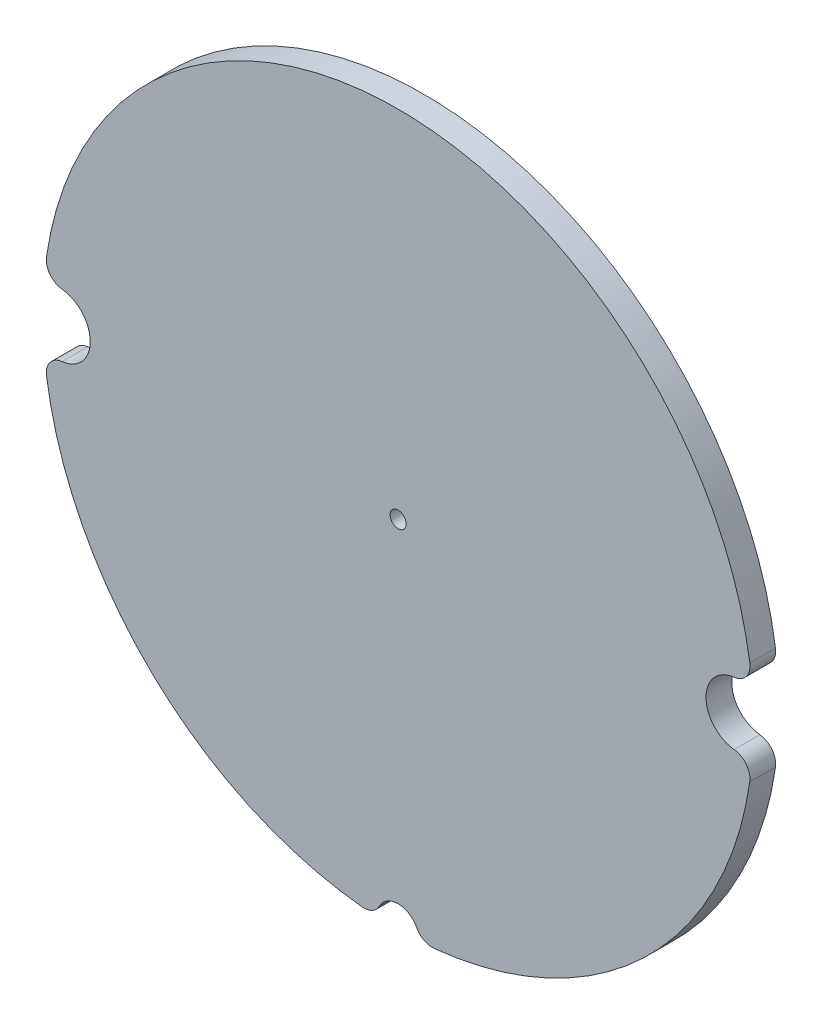
ISO-10303-21;
HEADER;
FILE_DESCRIPTION(('STEP AP214'),'2;1');
FILE_NAME('part.step','',(''),(''),'','','');
FILE_SCHEMA(('AUTOMOTIVE_DESIGN { 1 0 10303 214 1 1 1 1 }'));
ENDSEC;
DATA;
#1=APPLICATION_CONTEXT('core data for automotive mechanical design processes');
#2=APPLICATION_PROTOCOL_DEFINITION('international standard','automotive_design',2000,#1);
#3=PRODUCT_CONTEXT('',#1,'mechanical');
#4=PRODUCT('Part','Part','',(#3));
#5=PRODUCT_RELATED_PRODUCT_CATEGORY('part','',(#4));
#6=PRODUCT_DEFINITION_FORMATION('','',#4);
#7=PRODUCT_DEFINITION_CONTEXT('part definition',#1,'design');
#8=PRODUCT_DEFINITION('design','',#6,#7);
#9=PRODUCT_DEFINITION_SHAPE('','',#8);
#10=(LENGTH_UNIT() NAMED_UNIT(*) SI_UNIT(.MILLI.,.METRE.));
#11=(NAMED_UNIT(*) PLANE_ANGLE_UNIT() SI_UNIT($,.RADIAN.));
#12=(NAMED_UNIT(*) SI_UNIT($,.STERADIAN.) SOLID_ANGLE_UNIT());
#13=UNCERTAINTY_MEASURE_WITH_UNIT(LENGTH_MEASURE(1.E-05),#10,'distance_accuracy_value','');
#14=(GEOMETRIC_REPRESENTATION_CONTEXT(3) GLOBAL_UNCERTAINTY_ASSIGNED_CONTEXT((#13)) GLOBAL_UNIT_ASSIGNED_CONTEXT((#10,
#11,#12)) REPRESENTATION_CONTEXT('',''));
#15=CARTESIAN_POINT('',(0.,0.,0.));
#16=DIRECTION('',(0.,0.,1.));
#17=DIRECTION('',(1.,0.,0.));
#18=AXIS2_PLACEMENT_3D('',#15,#16,#17);
#19=CARTESIAN_POINT('',(-1.120000004768,-10.99300003051,0.80000348));
#20=DIRECTION('',(0.,0.,-1.));
#21=DIRECTION('',(-1.,0.,0.));
#22=AXIS2_PLACEMENT_3D('',#19,#20,#21);
#23=PLANE('',#22);
#24=CARTESIAN_POINT('',(0.,0.,0.80000348));
#25=DIRECTION('',(0.,0.,-1.));
#26=DIRECTION('',(-1.,0.,0.));
#27=AXIS2_PLACEMENT_3D('',#24,#25,#26);
#28=CIRCLE('',#27,0.2499995);
#29=CARTESIAN_POINT('',(-0.2499995,0.,0.80000348));
#30=VERTEX_POINT('',#29);
#31=EDGE_CURVE('E119',#30,#30,#28,.T.);
#32=ORIENTED_EDGE('',*,*,#31,.T.);
#33=EDGE_LOOP('',(#32));
#34=FACE_BOUND('',#33,.T.);
#35=CARTESIAN_POINT('',(0.,-10.99896654372,0.80000348));
#36=DIRECTION('',(0.,0.,-1.));
#37=DIRECTION('',(-1.,0.,0.));
#38=AXIS2_PLACEMENT_3D('',#35,#36,#37);
#39=CIRCLE('',#38,0.648966162251);
#40=CARTESIAN_POINT('',(-0.575999975203237,-10.6999998092604,0.80000348));
#41=VERTEX_POINT('',#40);
#42=CARTESIAN_POINT('',(0.575999975202705,-10.6999998092607,0.80000348));
#43=VERTEX_POINT('',#42);
#44=EDGE_CURVE('E128',#41,#43,#39,.T.);
#45=ORIENTED_EDGE('',*,*,#44,.T.);
#46=CARTESIAN_POINT('',(1.064088565313,-10.44529820453,0.80000348));
#47=DIRECTION('',(0.,0.,-1.));
#48=DIRECTION('',(-1.,0.,0.));
#49=AXIS2_PLACEMENT_3D('',#46,#47,#48);
#50=CIRCLE('',#49,0.550548253332);
#51=CARTESIAN_POINT('',(1.12000000476851,-10.993000030515,0.80000348));
#52=VERTEX_POINT('',#51);
#53=EDGE_CURVE('E130',#52,#43,#50,.T.);
#54=ORIENTED_EDGE('',*,*,#53,.F.);
#55=CARTESIAN_POINT('',(0.001166001366866,-0.0004141172533059,0.80000348));
#56=DIRECTION('',(0.,0.,-1.));
#57=DIRECTION('',(-1.,0.,0.));
#58=AXIS2_PLACEMENT_3D('',#55,#56,#57);
#59=CIRCLE('',#58,11.049377113107);
#60=CARTESIAN_POINT('',(10.9340000152586,-1.60099995136293,0.80000348));
#61=VERTEX_POINT('',#60);
#62=EDGE_CURVE('E134',#61,#52,#59,.T.);
#63=ORIENTED_EDGE('',*,*,#62,.F.);
#64=CARTESIAN_POINT('',(10.38866728457,-1.521844010123,0.80000348));
#65=DIRECTION('',(0.,0.,-1.));
#66=DIRECTION('',(-1.,0.,0.));
#67=AXIS2_PLACEMENT_3D('',#64,#65,#66);
#68=CIRCLE('',#67,0.551047593402);
#69=CARTESIAN_POINT('',(10.447999954224,-0.973999977112023,0.80000348));
#70=VERTEX_POINT('',#69);
#71=EDGE_CURVE('E137',#70,#61,#68,.T.);
#72=ORIENTED_EDGE('',*,*,#71,.F.);
#73=CARTESIAN_POINT('',(10.552600500174,0.,0.80000348));
#74=DIRECTION('',(0.,0.,-1.));
#75=DIRECTION('',(-1.,0.,0.));
#76=AXIS2_PLACEMENT_3D('',#73,#74,#75);
#77=CIRCLE('',#76,0.979600545951);
#78=CARTESIAN_POINT('',(10.447999954224,0.973999977112144,0.80000348));
#79=VERTEX_POINT('',#78);
#80=EDGE_CURVE('E140',#70,#79,#77,.T.);
#81=ORIENTED_EDGE('',*,*,#80,.T.);
#82=CARTESIAN_POINT('',(10.38866728457,1.521844010123,0.80000348));
#83=DIRECTION('',(0.,0.,-1.));
#84=DIRECTION('',(-1.,0.,0.));
#85=AXIS2_PLACEMENT_3D('',#82,#83,#84);
#86=CIRCLE('',#85,0.551047593402);
#87=CARTESIAN_POINT('',(10.9340000152587,1.60099995136296,0.80000348));
#88=VERTEX_POINT('',#87);
#89=EDGE_CURVE('E143',#88,#79,#86,.T.);
#90=ORIENTED_EDGE('',*,*,#89,.F.);
#91=CARTESIAN_POINT('',(0.,-0.0006907060202717,0.80000348));
#92=DIRECTION('',(0.,0.,-1.));
#93=DIRECTION('',(-1.,0.,0.));
#94=AXIS2_PLACEMENT_3D('',#91,#92,#93);
#95=CIRCLE('',#94,11.050690896755);
#96=CARTESIAN_POINT('',(-10.9340000152585,1.60099995136424,0.80000348));
#97=VERTEX_POINT('',#96);
#98=EDGE_CURVE('E147',#97,#88,#95,.T.);
#99=ORIENTED_EDGE('',*,*,#98,.F.);
#100=CARTESIAN_POINT('',(-10.38866728457,1.521844010123,0.80000348));
#101=DIRECTION('',(0.,0.,-1.));
#102=DIRECTION('',(-1.,0.,0.));
#103=AXIS2_PLACEMENT_3D('',#100,#101,#102);
#104=CIRCLE('',#103,0.551047593402);
#105=CARTESIAN_POINT('',(-10.44799995422,0.973999977111809,0.80000348));
#106=VERTEX_POINT('',#105);
#107=EDGE_CURVE('E150',#106,#97,#104,.T.);
#108=ORIENTED_EDGE('',*,*,#107,.F.);
#109=CARTESIAN_POINT('',(-10.55260050017,0.,0.80000348));
#110=DIRECTION('',(0.,0.,-1.));
#111=DIRECTION('',(-1.,0.,0.));
#112=AXIS2_PLACEMENT_3D('',#109,#110,#111);
#113=CIRCLE('',#112,0.979600545951);
#114=CARTESIAN_POINT('',(-10.44799995422,-0.973999977112144,0.80000348));
#115=VERTEX_POINT('',#114);
#116=EDGE_CURVE('E153',#106,#115,#113,.T.);
#117=ORIENTED_EDGE('',*,*,#116,.T.);
#118=CARTESIAN_POINT('',(-10.38866728457,-1.521844010123,0.80000348));
#119=DIRECTION('',(0.,0.,-1.));
#120=DIRECTION('',(-1.,0.,0.));
#121=AXIS2_PLACEMENT_3D('',#118,#119,#120);
#122=CIRCLE('',#121,0.551047593402);
#123=CARTESIAN_POINT('',(-10.9340000152584,-1.60099995136422,0.80000348));
#124=VERTEX_POINT('',#123);
#125=EDGE_CURVE('E108',#124,#115,#122,.T.);
#126=ORIENTED_EDGE('',*,*,#125,.F.);
#127=CARTESIAN_POINT('',(-0.001166001366866,-0.0004141172533059,0.80000348));
#128=DIRECTION('',(0.,0.,-1.));
#129=DIRECTION('',(-1.,0.,0.));
#130=AXIS2_PLACEMENT_3D('',#127,#128,#129);
#131=CIRCLE('',#130,11.049377113107);
#132=CARTESIAN_POINT('',(-1.1200000047685,-10.993000030515,0.80000348));
#133=VERTEX_POINT('',#132);
#134=EDGE_CURVE('E20',#133,#124,#131,.T.);
#135=ORIENTED_EDGE('',*,*,#134,.F.);
#136=CARTESIAN_POINT('',(-1.064088565313,-10.44529820453,0.80000348));
#137=DIRECTION('',(0.,0.,-1.));
#138=DIRECTION('',(-1.,0.,0.));
#139=AXIS2_PLACEMENT_3D('',#136,#137,#138);
#140=CIRCLE('',#139,0.550548253332);
#141=EDGE_CURVE('E106',#41,#133,#140,.T.);
#142=ORIENTED_EDGE('',*,*,#141,.F.);
#143=EDGE_LOOP('',(#45,#54,#63,#72,#81,#90,#99,#108,#117,#126,#135,#142));
#144=FACE_BOUND('',#143,.T.);
#145=ADVANCED_FACE('F17',(#34,#144),#23,.F.);
#146=CARTESIAN_POINT('',(-0.001166001366866,-0.0004141172533059,0.));
#147=DIRECTION('',(0.,0.,-1.));
#148=DIRECTION('',(-1.,0.,0.));
#149=AXIS2_PLACEMENT_3D('',#146,#147,#148);
#150=CYLINDRICAL_SURFACE('',#149,11.049377113107);
#151=ORIENTED_EDGE('',*,*,#134,.T.);
#152=DIRECTION('',(0.,0.,-1.));
#153=VECTOR('',#152,1.);
#154=CARTESIAN_POINT('',(-10.9340000152587,-1.60099995136426,0.));
#155=LINE('',#154,#153);
#156=CARTESIAN_POINT('',(-10.9340000152587,-1.60099995136426,0.));
#157=VERTEX_POINT('',#156);
#158=EDGE_CURVE('E111',#157,#124,#155,.F.);
#159=ORIENTED_EDGE('',*,*,#158,.F.);
#160=CARTESIAN_POINT('',(-0.001166001366866,-0.0004141172533059,0.));
#161=DIRECTION('',(0.,0.,-1.));
#162=DIRECTION('',(-1.,0.,0.));
#163=AXIS2_PLACEMENT_3D('',#160,#161,#162);
#164=CIRCLE('',#163,11.049377113107);
#165=CARTESIAN_POINT('',(-1.1200000047685,-10.993000030515,0.));
#166=VERTEX_POINT('',#165);
#167=EDGE_CURVE('E116',#166,#157,#164,.T.);
#168=ORIENTED_EDGE('',*,*,#167,.F.);
#169=DIRECTION('',(0.,0.,-1.));
#170=VECTOR('',#169,1.);
#171=CARTESIAN_POINT('',(-1.12000000476829,-10.9930000305129,0.));
#172=LINE('',#171,#170);
#173=EDGE_CURVE('E113',#133,#166,#172,.T.);
#174=ORIENTED_EDGE('',*,*,#173,.F.);
#175=EDGE_LOOP('',(#151,#159,#168,#174));
#176=FACE_BOUND('',#175,.T.);
#177=ADVANCED_FACE('F114',(#176),#150,.T.);
#178=CARTESIAN_POINT('',(-10.38866728457,-1.521844010123,0.));
#179=DIRECTION('',(0.,0.,-1.));
#180=DIRECTION('',(-1.,0.,0.));
#181=AXIS2_PLACEMENT_3D('',#178,#179,#180);
#182=CYLINDRICAL_SURFACE('',#181,0.551047593402);
#183=ORIENTED_EDGE('',*,*,#125,.T.);
#184=DIRECTION('',(0.,0.,-1.));
#185=VECTOR('',#184,1.);
#186=CARTESIAN_POINT('',(-10.44799995422,-0.973999977112144,0.));
#187=LINE('',#186,#185);
#188=CARTESIAN_POINT('',(-10.44799995422,-0.973999977112144,0.));
#189=VERTEX_POINT('',#188);
#190=EDGE_CURVE('E154',#115,#189,#187,.T.);
#191=ORIENTED_EDGE('',*,*,#190,.T.);
#192=CARTESIAN_POINT('',(-10.38866728457,-1.521844010123,0.));
#193=DIRECTION('',(0.,0.,-1.));
#194=DIRECTION('',(-1.,0.,0.));
#195=AXIS2_PLACEMENT_3D('',#192,#193,#194);
#196=CIRCLE('',#195,0.551047593402);
#197=EDGE_CURVE('E190',#157,#189,#196,.T.);
#198=ORIENTED_EDGE('',*,*,#197,.F.);
#199=ORIENTED_EDGE('',*,*,#158,.T.);
#200=EDGE_LOOP('',(#183,#191,#198,#199));
#201=FACE_BOUND('',#200,.T.);
#202=ADVANCED_FACE('F226',(#201),#182,.T.);
#203=CARTESIAN_POINT('',(-10.55260050017,0.,0.));
#204=DIRECTION('',(0.,0.,-1.));
#205=DIRECTION('',(-1.,0.,0.));
#206=AXIS2_PLACEMENT_3D('',#203,#204,#205);
#207=CYLINDRICAL_SURFACE('',#206,0.979600545951);
#208=ORIENTED_EDGE('',*,*,#190,.F.);
#209=ORIENTED_EDGE('',*,*,#116,.F.);
#210=DIRECTION('',(0.,0.,-1.));
#211=VECTOR('',#210,1.);
#212=CARTESIAN_POINT('',(-10.4479999542201,0.973999977111475,0.));
#213=LINE('',#212,#211);
#214=CARTESIAN_POINT('',(-10.4479999542201,0.973999977111475,0.));
#215=VERTEX_POINT('',#214);
#216=EDGE_CURVE('E152',#215,#106,#213,.F.);
#217=ORIENTED_EDGE('',*,*,#216,.F.);
#218=CARTESIAN_POINT('',(-10.55260050017,0.,0.));
#219=DIRECTION('',(0.,0.,-1.));
#220=DIRECTION('',(-1.,0.,0.));
#221=AXIS2_PLACEMENT_3D('',#218,#219,#220);
#222=CIRCLE('',#221,0.979600545951);
#223=EDGE_CURVE('E187',#189,#215,#222,.F.);
#224=ORIENTED_EDGE('',*,*,#223,.F.);
#225=EDGE_LOOP('',(#208,#209,#217,#224));
#226=FACE_BOUND('',#225,.T.);
#227=ADVANCED_FACE('F228',(#226),#207,.F.);
#228=CARTESIAN_POINT('',(-10.38866728457,1.521844010123,0.));
#229=DIRECTION('',(0.,0.,-1.));
#230=DIRECTION('',(-1.,0.,0.));
#231=AXIS2_PLACEMENT_3D('',#228,#229,#230);
#232=CYLINDRICAL_SURFACE('',#231,0.551047593402);
#233=ORIENTED_EDGE('',*,*,#107,.T.);
#234=DIRECTION('',(0.,0.,-1.));
#235=VECTOR('',#234,1.);
#236=CARTESIAN_POINT('',(-10.9340000152584,1.60099995136423,0.));
#237=LINE('',#236,#235);
#238=CARTESIAN_POINT('',(-10.9340000152584,1.60099995136423,0.));
#239=VERTEX_POINT('',#238);
#240=EDGE_CURVE('E149',#239,#97,#237,.F.);
#241=ORIENTED_EDGE('',*,*,#240,.F.);
#242=CARTESIAN_POINT('',(-10.38866728457,1.521844010123,0.));
#243=DIRECTION('',(0.,0.,-1.));
#244=DIRECTION('',(-1.,0.,0.));
#245=AXIS2_PLACEMENT_3D('',#242,#243,#244);
#246=CIRCLE('',#245,0.551047593402);
#247=EDGE_CURVE('E184',#215,#239,#246,.T.);
#248=ORIENTED_EDGE('',*,*,#247,.F.);
#249=ORIENTED_EDGE('',*,*,#216,.T.);
#250=EDGE_LOOP('',(#233,#241,#248,#249));
#251=FACE_BOUND('',#250,.T.);
#252=ADVANCED_FACE('F230',(#251),#232,.T.);
#253=CARTESIAN_POINT('',(0.,-0.0006907060202717,0.));
#254=DIRECTION('',(0.,0.,-1.));
#255=DIRECTION('',(-1.,0.,0.));
#256=AXIS2_PLACEMENT_3D('',#253,#254,#255);
#257=CYLINDRICAL_SURFACE('',#256,11.050690896755);
#258=ORIENTED_EDGE('',*,*,#98,.T.);
#259=DIRECTION('',(0.,0.,-1.));
#260=VECTOR('',#259,1.);
#261=CARTESIAN_POINT('',(10.9340000152588,1.60099995136298,0.));
#262=LINE('',#261,#260);
#263=CARTESIAN_POINT('',(10.9340000152588,1.60099995136298,0.));
#264=VERTEX_POINT('',#263);
#265=EDGE_CURVE('E146',#264,#88,#262,.F.);
#266=ORIENTED_EDGE('',*,*,#265,.F.);
#267=CARTESIAN_POINT('',(0.,-0.0006907060202717,0.));
#268=DIRECTION('',(0.,0.,-1.));
#269=DIRECTION('',(-1.,0.,0.));
#270=AXIS2_PLACEMENT_3D('',#267,#268,#269);
#271=CIRCLE('',#270,11.050690896755);
#272=EDGE_CURVE('E181',#239,#264,#271,.T.);
#273=ORIENTED_EDGE('',*,*,#272,.F.);
#274=ORIENTED_EDGE('',*,*,#240,.T.);
#275=EDGE_LOOP('',(#258,#266,#273,#274));
#276=FACE_BOUND('',#275,.T.);
#277=ADVANCED_FACE('F234',(#276),#257,.T.);
#278=CARTESIAN_POINT('',(10.38866728457,1.521844010123,0.));
#279=DIRECTION('',(0.,0.,-1.));
#280=DIRECTION('',(-1.,0.,0.));
#281=AXIS2_PLACEMENT_3D('',#278,#279,#280);
#282=CYLINDRICAL_SURFACE('',#281,0.551047593402);
#283=ORIENTED_EDGE('',*,*,#89,.T.);
#284=DIRECTION('',(0.,0.,-1.));
#285=VECTOR('',#284,1.);
#286=CARTESIAN_POINT('',(10.447999954224,0.973999977112144,0.));
#287=LINE('',#286,#285);
#288=CARTESIAN_POINT('',(10.447999954224,0.973999977112144,0.));
#289=VERTEX_POINT('',#288);
#290=EDGE_CURVE('E142',#79,#289,#287,.T.);
#291=ORIENTED_EDGE('',*,*,#290,.T.);
#292=CARTESIAN_POINT('',(10.38866728457,1.521844010123,0.));
#293=DIRECTION('',(0.,0.,-1.));
#294=DIRECTION('',(-1.,0.,0.));
#295=AXIS2_PLACEMENT_3D('',#292,#293,#294);
#296=CIRCLE('',#295,0.551047593402);
#297=EDGE_CURVE('E178',#264,#289,#296,.T.);
#298=ORIENTED_EDGE('',*,*,#297,.F.);
#299=ORIENTED_EDGE('',*,*,#265,.T.);
#300=EDGE_LOOP('',(#283,#291,#298,#299));
#301=FACE_BOUND('',#300,.T.);
#302=ADVANCED_FACE('F238',(#301),#282,.T.);
#303=CARTESIAN_POINT('',(10.552600500174,0.,0.));
#304=DIRECTION('',(0.,0.,-1.));
#305=DIRECTION('',(-1.,0.,0.));
#306=AXIS2_PLACEMENT_3D('',#303,#304,#305);
#307=CYLINDRICAL_SURFACE('',#306,0.979600545951);
#308=ORIENTED_EDGE('',*,*,#290,.F.);
#309=ORIENTED_EDGE('',*,*,#80,.F.);
#310=DIRECTION('',(0.,0.,-1.));
#311=VECTOR('',#310,1.);
#312=CARTESIAN_POINT('',(10.447999954224,-0.973999977111903,0.));
#313=LINE('',#312,#311);
#314=CARTESIAN_POINT('',(10.447999954224,-0.973999977111903,0.));
#315=VERTEX_POINT('',#314);
#316=EDGE_CURVE('E139',#315,#70,#313,.F.);
#317=ORIENTED_EDGE('',*,*,#316,.F.);
#318=CARTESIAN_POINT('',(10.552600500174,0.,0.));
#319=DIRECTION('',(0.,0.,-1.));
#320=DIRECTION('',(-1.,0.,0.));
#321=AXIS2_PLACEMENT_3D('',#318,#319,#320);
#322=CIRCLE('',#321,0.979600545951);
#323=EDGE_CURVE('E175',#289,#315,#322,.F.);
#324=ORIENTED_EDGE('',*,*,#323,.F.);
#325=EDGE_LOOP('',(#308,#309,#317,#324));
#326=FACE_BOUND('',#325,.T.);
#327=ADVANCED_FACE('F243',(#326),#307,.F.);
#328=CARTESIAN_POINT('',(10.38866728457,-1.521844010123,0.));
#329=DIRECTION('',(0.,0.,-1.));
#330=DIRECTION('',(-1.,0.,0.));
#331=AXIS2_PLACEMENT_3D('',#328,#329,#330);
#332=CYLINDRICAL_SURFACE('',#331,0.551047593402);
#333=ORIENTED_EDGE('',*,*,#71,.T.);
#334=DIRECTION('',(0.,0.,-1.));
#335=VECTOR('',#334,1.);
#336=CARTESIAN_POINT('',(10.9340000152583,-1.60099995136289,0.));
#337=LINE('',#336,#335);
#338=CARTESIAN_POINT('',(10.9340000152583,-1.60099995136288,0.));
#339=VERTEX_POINT('',#338);
#340=EDGE_CURVE('E136',#339,#61,#337,.F.);
#341=ORIENTED_EDGE('',*,*,#340,.F.);
#342=CARTESIAN_POINT('',(10.38866728457,-1.521844010123,0.));
#343=DIRECTION('',(0.,0.,-1.));
#344=DIRECTION('',(-1.,0.,0.));
#345=AXIS2_PLACEMENT_3D('',#342,#343,#344);
#346=CIRCLE('',#345,0.551047593402);
#347=EDGE_CURVE('E172',#315,#339,#346,.T.);
#348=ORIENTED_EDGE('',*,*,#347,.F.);
#349=ORIENTED_EDGE('',*,*,#316,.T.);
#350=EDGE_LOOP('',(#333,#341,#348,#349));
#351=FACE_BOUND('',#350,.T.);
#352=ADVANCED_FACE('F246',(#351),#332,.T.);
#353=CARTESIAN_POINT('',(0.001166001366866,-0.0004141172533059,0.));
#354=DIRECTION('',(0.,0.,-1.));
#355=DIRECTION('',(-1.,0.,0.));
#356=AXIS2_PLACEMENT_3D('',#353,#354,#355);
#357=CYLINDRICAL_SURFACE('',#356,11.049377113107);
#358=ORIENTED_EDGE('',*,*,#62,.T.);
#359=DIRECTION('',(0.,0.,-1.));
#360=VECTOR('',#359,1.);
#361=CARTESIAN_POINT('',(1.12000000476829,-10.9930000305129,0.));
#362=LINE('',#361,#360);
#363=CARTESIAN_POINT('',(1.12000000476829,-10.9930000305129,0.));
#364=VERTEX_POINT('',#363);
#365=EDGE_CURVE('E133',#364,#52,#362,.F.);
#366=ORIENTED_EDGE('',*,*,#365,.F.);
#367=CARTESIAN_POINT('',(0.001166001366866,-0.0004141172533059,0.));
#368=DIRECTION('',(0.,0.,-1.));
#369=DIRECTION('',(-1.,0.,0.));
#370=AXIS2_PLACEMENT_3D('',#367,#368,#369);
#371=CIRCLE('',#370,11.049377113107);
#372=EDGE_CURVE('E169',#339,#364,#371,.T.);
#373=ORIENTED_EDGE('',*,*,#372,.F.);
#374=ORIENTED_EDGE('',*,*,#340,.T.);
#375=EDGE_LOOP('',(#358,#366,#373,#374));
#376=FACE_BOUND('',#375,.T.);
#377=ADVANCED_FACE('F250',(#376),#357,.T.);
#378=CARTESIAN_POINT('',(1.064088565313,-10.44529820453,0.));
#379=DIRECTION('',(0.,0.,-1.));
#380=DIRECTION('',(-1.,0.,0.));
#381=AXIS2_PLACEMENT_3D('',#378,#379,#380);
#382=CYLINDRICAL_SURFACE('',#381,0.550548253332);
#383=ORIENTED_EDGE('',*,*,#53,.T.);
#384=DIRECTION('',(0.,0.,-1.));
#385=VECTOR('',#384,1.);
#386=CARTESIAN_POINT('',(0.575999975202705,-10.6999998092607,0.));
#387=LINE('',#386,#385);
#388=CARTESIAN_POINT('',(0.575999975202705,-10.6999998092607,0.));
#389=VERTEX_POINT('',#388);
#390=EDGE_CURVE('E123',#43,#389,#387,.T.);
#391=ORIENTED_EDGE('',*,*,#390,.T.);
#392=CARTESIAN_POINT('',(1.064088565313,-10.44529820453,0.));
#393=DIRECTION('',(0.,0.,-1.));
#394=DIRECTION('',(-1.,0.,0.));
#395=AXIS2_PLACEMENT_3D('',#392,#393,#394);
#396=CIRCLE('',#395,0.550548253332);
#397=EDGE_CURVE('E166',#364,#389,#396,.T.);
#398=ORIENTED_EDGE('',*,*,#397,.F.);
#399=ORIENTED_EDGE('',*,*,#365,.T.);
#400=EDGE_LOOP('',(#383,#391,#398,#399));
#401=FACE_BOUND('',#400,.T.);
#402=ADVANCED_FACE('F252',(#401),#382,.T.);
#403=CARTESIAN_POINT('',(0.,-10.99896654372,0.));
#404=DIRECTION('',(0.,0.,-1.));
#405=DIRECTION('',(-1.,0.,0.));
#406=AXIS2_PLACEMENT_3D('',#403,#404,#405);
#407=CYLINDRICAL_SURFACE('',#406,0.648966162251);
#408=ORIENTED_EDGE('',*,*,#390,.F.);
#409=ORIENTED_EDGE('',*,*,#44,.F.);
#410=DIRECTION('',(0.,0.,-1.));
#411=VECTOR('',#410,1.);
#412=CARTESIAN_POINT('',(-0.575999975203769,-10.6999998092601,0.));
#413=LINE('',#412,#411);
#414=CARTESIAN_POINT('',(-0.575999975203769,-10.6999998092601,0.));
#415=VERTEX_POINT('',#414);
#416=EDGE_CURVE('E35',#415,#41,#413,.F.);
#417=ORIENTED_EDGE('',*,*,#416,.F.);
#418=CARTESIAN_POINT('',(0.,-10.99896654372,0.));
#419=DIRECTION('',(0.,0.,-1.));
#420=DIRECTION('',(-1.,0.,0.));
#421=AXIS2_PLACEMENT_3D('',#418,#419,#420);
#422=CIRCLE('',#421,0.648966162251);
#423=EDGE_CURVE('E163',#389,#415,#422,.F.);
#424=ORIENTED_EDGE('',*,*,#423,.F.);
#425=EDGE_LOOP('',(#408,#409,#417,#424));
#426=FACE_BOUND('',#425,.T.);
#427=ADVANCED_FACE('F208',(#426),#407,.F.);
#428=CARTESIAN_POINT('',(-1.064088565313,-10.44529820453,0.));
#429=DIRECTION('',(0.,0.,-1.));
#430=DIRECTION('',(-1.,0.,0.));
#431=AXIS2_PLACEMENT_3D('',#428,#429,#430);
#432=CYLINDRICAL_SURFACE('',#431,0.550548253332);
#433=ORIENTED_EDGE('',*,*,#141,.T.);
#434=ORIENTED_EDGE('',*,*,#173,.T.);
#435=CARTESIAN_POINT('',(-1.064088565313,-10.44529820453,0.));
#436=DIRECTION('',(0.,0.,-1.));
#437=DIRECTION('',(-1.,0.,0.));
#438=AXIS2_PLACEMENT_3D('',#435,#436,#437);
#439=CIRCLE('',#438,0.550548253332);
#440=EDGE_CURVE('E26',#415,#166,#439,.T.);
#441=ORIENTED_EDGE('',*,*,#440,.F.);
#442=ORIENTED_EDGE('',*,*,#416,.T.);
#443=EDGE_LOOP('',(#433,#434,#441,#442));
#444=FACE_BOUND('',#443,.T.);
#445=ADVANCED_FACE('F121',(#444),#432,.T.);
#446=CARTESIAN_POINT('',(0.,0.,0.));
#447=DIRECTION('',(0.,0.,-1.));
#448=DIRECTION('',(-1.,0.,0.));
#449=AXIS2_PLACEMENT_3D('',#446,#447,#448);
#450=CYLINDRICAL_SURFACE('',#449,0.2499995);
#451=ORIENTED_EDGE('',*,*,#31,.F.);
#452=EDGE_LOOP('',(#451));
#453=FACE_BOUND('',#452,.T.);
#454=CARTESIAN_POINT('',(0.,0.,0.));
#455=DIRECTION('',(0.,0.,-1.));
#456=DIRECTION('',(-1.,0.,0.));
#457=AXIS2_PLACEMENT_3D('',#454,#455,#456);
#458=CIRCLE('',#457,0.2499995);
#459=CARTESIAN_POINT('',(-0.2499995,0.,0.));
#460=VERTEX_POINT('',#459);
#461=EDGE_CURVE('E11',#460,#460,#458,.F.);
#462=ORIENTED_EDGE('',*,*,#461,.F.);
#463=EDGE_LOOP('',(#462));
#464=FACE_BOUND('',#463,.T.);
#465=ADVANCED_FACE('F197',(#453,#464),#450,.F.);
#466=CARTESIAN_POINT('',(-1.120000004768,-10.99300003051,0.));
#467=DIRECTION('',(0.,0.,-1.));
#468=DIRECTION('',(-1.,0.,0.));
#469=AXIS2_PLACEMENT_3D('',#466,#467,#468);
#470=PLANE('',#469);
#471=ORIENTED_EDGE('',*,*,#461,.T.);
#472=EDGE_LOOP('',(#471));
#473=FACE_BOUND('',#472,.T.);
#474=ORIENTED_EDGE('',*,*,#423,.T.);
#475=ORIENTED_EDGE('',*,*,#440,.T.);
#476=ORIENTED_EDGE('',*,*,#167,.T.);
#477=ORIENTED_EDGE('',*,*,#197,.T.);
#478=ORIENTED_EDGE('',*,*,#223,.T.);
#479=ORIENTED_EDGE('',*,*,#247,.T.);
#480=ORIENTED_EDGE('',*,*,#272,.T.);
#481=ORIENTED_EDGE('',*,*,#297,.T.);
#482=ORIENTED_EDGE('',*,*,#323,.T.);
#483=ORIENTED_EDGE('',*,*,#347,.T.);
#484=ORIENTED_EDGE('',*,*,#372,.T.);
#485=ORIENTED_EDGE('',*,*,#397,.T.);
#486=EDGE_LOOP('',(#474,#475,#476,#477,#478,#479,#480,#481,#482,#483,#484,#485));
#487=FACE_BOUND('',#486,.T.);
#488=ADVANCED_FACE('F200',(#473,#487),#470,.T.);
#489=CLOSED_SHELL('',(#145,#177,#202,#227,#252,#277,#302,#327,#352,#377,#402,#427,#445,#465,#488));
#490=MANIFOLD_SOLID_BREP('B1',#489);
#491=ADVANCED_BREP_SHAPE_REPRESENTATION('',(#18,#490),#14);
#492=SHAPE_DEFINITION_REPRESENTATION(#9,#491);
ENDSEC;
END-ISO-10303-21;
